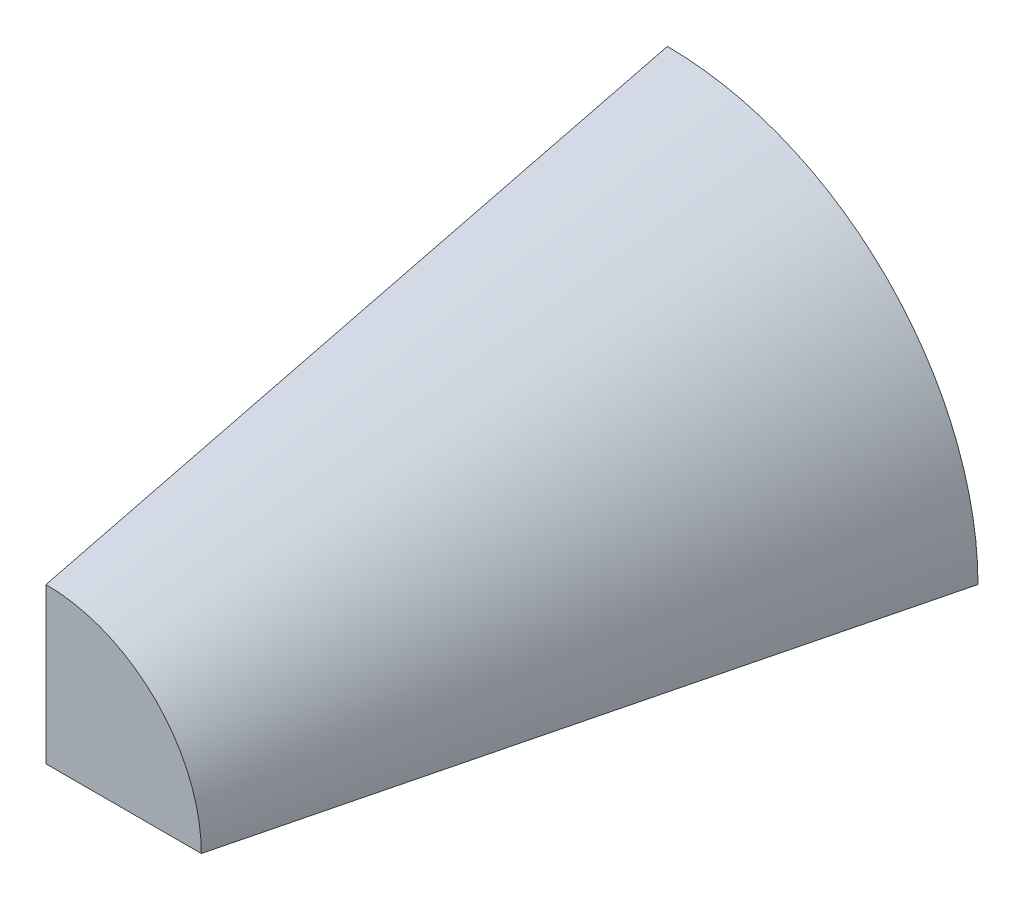
ISO-10303-21;
HEADER;
FILE_DESCRIPTION(('STEP AP214'),'2;1');
FILE_NAME('part.step','',(''),(''),'','','');
FILE_SCHEMA(('AUTOMOTIVE_DESIGN { 1 0 10303 214 1 1 1 1 }'));
ENDSEC;
DATA;
#1=APPLICATION_CONTEXT('core data for automotive mechanical design processes');
#2=APPLICATION_PROTOCOL_DEFINITION('international standard','automotive_design',2000,#1);
#3=PRODUCT_CONTEXT('',#1,'mechanical');
#4=PRODUCT('Part','Part','',(#3));
#5=PRODUCT_RELATED_PRODUCT_CATEGORY('part','',(#4));
#6=PRODUCT_DEFINITION_FORMATION('','',#4);
#7=PRODUCT_DEFINITION_CONTEXT('part definition',#1,'design');
#8=PRODUCT_DEFINITION('design','',#6,#7);
#9=PRODUCT_DEFINITION_SHAPE('','',#8);
#10=(LENGTH_UNIT() NAMED_UNIT(*) SI_UNIT(.MILLI.,.METRE.));
#11=(NAMED_UNIT(*) PLANE_ANGLE_UNIT() SI_UNIT($,.RADIAN.));
#12=(NAMED_UNIT(*) SI_UNIT($,.STERADIAN.) SOLID_ANGLE_UNIT());
#13=UNCERTAINTY_MEASURE_WITH_UNIT(LENGTH_MEASURE(1.E-05),#10,'distance_accuracy_value','');
#14=(GEOMETRIC_REPRESENTATION_CONTEXT(3) GLOBAL_UNCERTAINTY_ASSIGNED_CONTEXT((#13)) GLOBAL_UNIT_ASSIGNED_CONTEXT((#10,
#11,#12)) REPRESENTATION_CONTEXT('',''));
#15=CARTESIAN_POINT('',(0.,0.,0.));
#16=DIRECTION('',(0.,0.,1.));
#17=DIRECTION('',(1.,0.,0.));
#18=AXIS2_PLACEMENT_3D('',#15,#16,#17);
#19=CARTESIAN_POINT('',(0.,0.,0.));
#20=DIRECTION('',(0.,0.,-1.));
#21=DIRECTION('',(-1.,0.,0.));
#22=AXIS2_PLACEMENT_3D('',#19,#20,#21);
#23=PLANE('',#22);
#24=CARTESIAN_POINT('',(0.,0.,0.));
#25=DIRECTION('',(0.,0.,-1.));
#26=DIRECTION('',(-1.,0.,0.));
#27=AXIS2_PLACEMENT_3D('',#24,#25,#26);
#28=CIRCLE('',#27,10.);
#29=CARTESIAN_POINT('',(0.,10.,0.));
#30=VERTEX_POINT('',#29);
#31=CARTESIAN_POINT('',(10.,0.,0.));
#32=VERTEX_POINT('',#31);
#33=EDGE_CURVE('E11',#30,#32,#28,.T.);
#34=ORIENTED_EDGE('',*,*,#33,.T.);
#35=DIRECTION('',(1.,0.,0.));
#36=VECTOR('',#35,1.);
#37=CARTESIAN_POINT('',(0.,0.,0.));
#38=LINE('',#37,#36);
#39=CARTESIAN_POINT('',(0.,0.,0.));
#40=VERTEX_POINT('',#39);
#41=EDGE_CURVE('E77',#40,#32,#38,.T.);
#42=ORIENTED_EDGE('',*,*,#41,.F.);
#43=DIRECTION('',(0.,1.,0.));
#44=VECTOR('',#43,1.);
#45=CARTESIAN_POINT('',(0.,0.,0.));
#46=LINE('',#45,#44);
#47=EDGE_CURVE('E79',#40,#30,#46,.T.);
#48=ORIENTED_EDGE('',*,*,#47,.T.);
#49=EDGE_LOOP('',(#34,#42,#48));
#50=FACE_BOUND('',#49,.T.);
#51=ADVANCED_FACE('F43',(#50),#23,.T.);
#52=CARTESIAN_POINT('',(0.,0.,0.));
#53=DIRECTION('',(0.,0.,-1.));
#54=DIRECTION('',(-1.,0.,0.));
#55=AXIS2_PLACEMENT_3D('',#52,#53,#54);
#56=CONICAL_SURFACE('',#55,10.,0.244978663126864);
#57=CARTESIAN_POINT('',(0.,0.,20.));
#58=DIRECTION('',(0.,0.,-1.));
#59=DIRECTION('',(-1.,0.,0.));
#60=AXIS2_PLACEMENT_3D('',#57,#58,#59);
#61=CIRCLE('',#60,5.);
#62=CARTESIAN_POINT('',(0.,5.,20.));
#63=VERTEX_POINT('',#62);
#64=CARTESIAN_POINT('',(5.,0.,20.));
#65=VERTEX_POINT('',#64);
#66=EDGE_CURVE('E50',#63,#65,#61,.T.);
#67=ORIENTED_EDGE('',*,*,#66,.T.);
#68=DIRECTION('',(-0.242535625036333,0.,0.970142500145332));
#69=VECTOR('',#68,1.);
#70=CARTESIAN_POINT('',(10.,0.,0.));
#71=LINE('',#70,#69);
#72=EDGE_CURVE('E84',#32,#65,#71,.T.);
#73=ORIENTED_EDGE('',*,*,#72,.F.);
#74=ORIENTED_EDGE('',*,*,#33,.F.);
#75=DIRECTION('',(0.,-0.242535625036333,0.970142500145332));
#76=VECTOR('',#75,1.);
#77=CARTESIAN_POINT('',(0.,10.,0.));
#78=LINE('',#77,#76);
#79=EDGE_CURVE('E93',#30,#63,#78,.T.);
#80=ORIENTED_EDGE('',*,*,#79,.T.);
#81=EDGE_LOOP('',(#67,#73,#74,#80));
#82=FACE_BOUND('',#81,.T.);
#83=ADVANCED_FACE('F87',(#82),#56,.T.);
#84=CARTESIAN_POINT('',(0.,5.,20.));
#85=DIRECTION('',(0.,0.,1.));
#86=DIRECTION('',(1.,0.,0.));
#87=AXIS2_PLACEMENT_3D('',#84,#85,#86);
#88=PLANE('',#87);
#89=DIRECTION('',(0.,-1.,0.));
#90=VECTOR('',#89,1.);
#91=CARTESIAN_POINT('',(0.,5.,20.));
#92=LINE('',#91,#90);
#93=CARTESIAN_POINT('',(0.,0.,20.));
#94=VERTEX_POINT('',#93);
#95=EDGE_CURVE('E95',#63,#94,#92,.T.);
#96=ORIENTED_EDGE('',*,*,#95,.T.);
#97=DIRECTION('',(-1.,0.,0.));
#98=VECTOR('',#97,1.);
#99=CARTESIAN_POINT('',(5.,0.,20.));
#100=LINE('',#99,#98);
#101=EDGE_CURVE('E57',#65,#94,#100,.T.);
#102=ORIENTED_EDGE('',*,*,#101,.F.);
#103=ORIENTED_EDGE('',*,*,#66,.F.);
#104=EDGE_LOOP('',(#96,#102,#103));
#105=FACE_BOUND('',#104,.T.);
#106=ADVANCED_FACE('F97',(#105),#88,.T.);
#107=CARTESIAN_POINT('',(0.,0.,0.));
#108=DIRECTION('',(1.,0.,0.));
#109=DIRECTION('',(0.,0.,-1.));
#110=AXIS2_PLACEMENT_3D('',#107,#108,#109);
#111=PLANE('',#110);
#112=DIRECTION('',(0.,0.,-1.));
#113=VECTOR('',#112,1.);
#114=CARTESIAN_POINT('',(0.,0.,20.));
#115=LINE('',#114,#113);
#116=EDGE_CURVE('E85',#94,#40,#115,.T.);
#117=ORIENTED_EDGE('',*,*,#116,.F.);
#118=ORIENTED_EDGE('',*,*,#95,.F.);
#119=ORIENTED_EDGE('',*,*,#79,.F.);
#120=ORIENTED_EDGE('',*,*,#47,.F.);
#121=EDGE_LOOP('',(#117,#118,#119,#120));
#122=FACE_BOUND('',#121,.T.);
#123=ADVANCED_FACE('F99',(#122),#111,.F.);
#124=CARTESIAN_POINT('',(0.,0.,0.));
#125=DIRECTION('',(0.,-1.,0.));
#126=DIRECTION('',(0.,0.,-1.));
#127=AXIS2_PLACEMENT_3D('',#124,#125,#126);
#128=PLANE('',#127);
#129=ORIENTED_EDGE('',*,*,#116,.T.);
#130=ORIENTED_EDGE('',*,*,#41,.T.);
#131=ORIENTED_EDGE('',*,*,#72,.T.);
#132=ORIENTED_EDGE('',*,*,#101,.T.);
#133=EDGE_LOOP('',(#129,#130,#131,#132));
#134=FACE_BOUND('',#133,.T.);
#135=ADVANCED_FACE('F83',(#134),#128,.T.);
#136=CLOSED_SHELL('',(#51,#83,#106,#123,#135));
#137=MANIFOLD_SOLID_BREP('B2',#136);
#138=ADVANCED_BREP_SHAPE_REPRESENTATION('',(#18,#137),#14);
#139=SHAPE_DEFINITION_REPRESENTATION(#9,#138);
ENDSEC;
END-ISO-10303-21;
